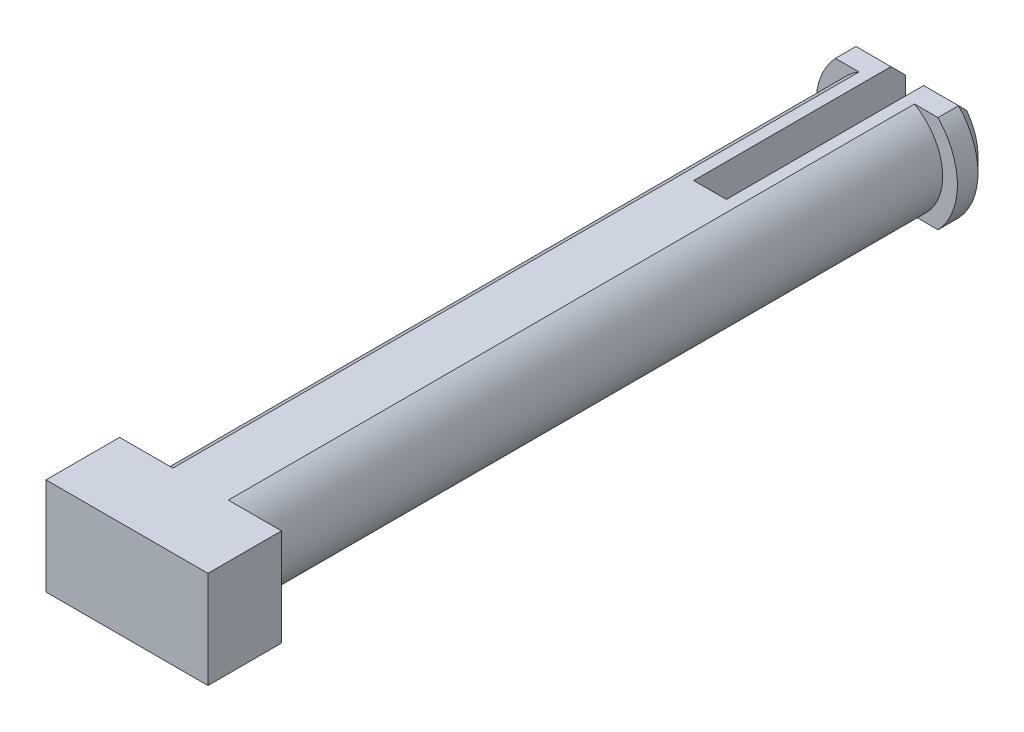
ISO-10303-21;
HEADER;
FILE_DESCRIPTION(('STEP AP214'),'2;1');
FILE_NAME('part.step','',(''),(''),'','','');
FILE_SCHEMA(('AUTOMOTIVE_DESIGN { 1 0 10303 214 1 1 1 1 }'));
ENDSEC;
DATA;
#1=APPLICATION_CONTEXT('core data for automotive mechanical design processes');
#2=APPLICATION_PROTOCOL_DEFINITION('international standard','automotive_design',2000,#1);
#3=PRODUCT_CONTEXT('',#1,'mechanical');
#4=PRODUCT('Part','Part','',(#3));
#5=PRODUCT_RELATED_PRODUCT_CATEGORY('part','',(#4));
#6=PRODUCT_DEFINITION_FORMATION('','',#4);
#7=PRODUCT_DEFINITION_CONTEXT('part definition',#1,'design');
#8=PRODUCT_DEFINITION('design','',#6,#7);
#9=PRODUCT_DEFINITION_SHAPE('','',#8);
#10=(LENGTH_UNIT() NAMED_UNIT(*) SI_UNIT(.MILLI.,.METRE.));
#11=(NAMED_UNIT(*) PLANE_ANGLE_UNIT() SI_UNIT($,.RADIAN.));
#12=(NAMED_UNIT(*) SI_UNIT($,.STERADIAN.) SOLID_ANGLE_UNIT());
#13=UNCERTAINTY_MEASURE_WITH_UNIT(LENGTH_MEASURE(1.E-05),#10,'distance_accuracy_value','');
#14=(GEOMETRIC_REPRESENTATION_CONTEXT(3) GLOBAL_UNCERTAINTY_ASSIGNED_CONTEXT((#13)) GLOBAL_UNIT_ASSIGNED_CONTEXT((#10,
#11,#12)) REPRESENTATION_CONTEXT('',''));
#15=CARTESIAN_POINT('',(0.,0.,0.));
#16=DIRECTION('',(0.,0.,1.));
#17=DIRECTION('',(1.,0.,0.));
#18=AXIS2_PLACEMENT_3D('',#15,#16,#17);
#19=CARTESIAN_POINT('',(-66.7025607667802,-3.96227490896884,-41.5389637783194));
#20=DIRECTION('',(0.,0.,-1.));
#21=DIRECTION('',(-1.,0.,0.));
#22=AXIS2_PLACEMENT_3D('',#19,#20,#21);
#23=PLANE('',#22);
#24=CARTESIAN_POINT('',(-67.5846124205548,-3.37227490896886,-41.5389637783194));
#25=CARTESIAN_POINT('',(-67.5522619842056,-3.32972790171934,-41.5389637783194));
#26=CARTESIAN_POINT('',(-67.5217229321666,-3.28583578238253,-41.5389637783194));
#27=CARTESIAN_POINT('',(-67.4644494482153,-3.19563873478716,-41.5389637783194));
#28=CARTESIAN_POINT('',(-67.4377148375345,-3.14933392003946,-41.5389637783194));
#29=CARTESIAN_POINT('',(-67.3635548359027,-3.00734191422758,-41.5389637783194));
#30=CARTESIAN_POINT('',(-67.3220824232597,-2.90845743374898,-41.5389637783194));
#31=CARTESIAN_POINT('',(-67.2563331172992,-2.70513908441693,-41.5389637783194));
#32=CARTESIAN_POINT('',(-67.2320633039026,-2.60070294970495,-41.5389637783194));
#33=CARTESIAN_POINT('',(-67.2014027690068,-2.38925544141901,-41.5389637783194));
#34=CARTESIAN_POINT('',(-67.1950067065084,-2.28224484678252,-41.5389637783194));
#35=CARTESIAN_POINT('',(-67.200268722267,-2.06866591420379,-41.5389637783194));
#36=CARTESIAN_POINT('',(-67.2119285266223,-1.96209761952093,-41.5389637783194));
#37=CARTESIAN_POINT('',(-67.2529801960669,-1.75240301461169,-41.5389637783194));
#38=CARTESIAN_POINT('',(-67.2823739711556,-1.6492770763997,-41.5389637783194));
#39=CARTESIAN_POINT('',(-67.3525319041563,-1.4640226590677,-41.5389637783194));
#40=CARTESIAN_POINT('',(-67.3910183764261,-1.38102271377649,-41.5389637783194));
#41=CARTESIAN_POINT('',(-67.479441600321,-1.22144301219026,-41.5389637783194));
#42=CARTESIAN_POINT('',(-67.5293702449939,-1.14485876249059,-41.5389637783194));
#43=CARTESIAN_POINT('',(-67.5846124205546,-1.07227490896894,-41.5389637783194));
#44=B_SPLINE_CURVE_WITH_KNOTS('',3,(#24,#25,#26,#27,#28,#29,#30,#31,#32,#33,#34,#35,#36,#37,#38,
#39,#40,#41,#42,#43),.UNSPECIFIED.,.F.,.F.,(4,2,2,2,2,2,2,2,2,4),(0.,0.160248576795769,
0.320489621120828,0.640526560583316,0.960695138447689,1.28076803393214,1.60087152951913,
1.9210095073255,2.19455099917785,2.46789927867105),.UNSPECIFIED.);
#45=CARTESIAN_POINT('',(-67.5846124205548,-3.37227490896887,-41.5389637783194));
#46=VERTEX_POINT('',#45);
#47=CARTESIAN_POINT('',(-67.5846124205547,-1.07227490896885,-41.5389637783194));
#48=VERTEX_POINT('',#47);
#49=EDGE_CURVE('E20',#46,#48,#44,.T.);
#50=ORIENTED_EDGE('',*,*,#49,.F.);
#51=DIRECTION('',(1.,0.,0.));
#52=VECTOR('',#51,1.);
#53=CARTESIAN_POINT('',(-66.8754340104075,-3.37227490896888,-41.5389637783194));
#54=LINE('',#53,#52);
#55=CARTESIAN_POINT('',(-68.5420607667802,-3.37227490896887,-41.5389637783194));
#56=VERTEX_POINT('',#55);
#57=EDGE_CURVE('E362',#56,#46,#54,.T.);
#58=ORIENTED_EDGE('',*,*,#57,.F.);
#59=DIRECTION('',(0.,1.,0.));
#60=VECTOR('',#59,1.);
#61=CARTESIAN_POINT('',(-68.5420607667802,0.117725091031185,-41.5389637783194));
#62=LINE('',#61,#60);
#63=CARTESIAN_POINT('',(-68.5420607667802,-1.07227490896879,-41.5389637783194));
#64=VERTEX_POINT('',#63);
#65=EDGE_CURVE('E117',#64,#56,#62,.F.);
#66=ORIENTED_EDGE('',*,*,#65,.F.);
#67=DIRECTION('',(1.,0.,0.));
#68=VECTOR('',#67,1.);
#69=CARTESIAN_POINT('',(-69.0208450173595,-1.07227490896878,-41.5389637783194));
#70=LINE('',#69,#68);
#71=EDGE_CURVE('E216',#48,#64,#70,.F.);
#72=ORIENTED_EDGE('',*,*,#71,.F.);
#73=EDGE_LOOP('',(#50,#58,#66,#72));
#74=FACE_BOUND('',#73,.T.);
#75=ADVANCED_FACE('F16',(#74),#23,.T.);
#76=CARTESIAN_POINT('',(-69.0970607667802,-2.22227490896883,-43.4389637783194));
#77=CARTESIAN_POINT('',(-69.0970607667802,-4.86347490896883,-40.7977637783194));
#78=CARTESIAN_POINT('',(-69.0970607667802,-2.22227490896883,-43.4389637783194));
#79=CARTESIAN_POINT('',(-66.4558607667802,-4.86347490896883,-40.7977637783194));
#80=CARTESIAN_POINT('',(-69.0970607667802,-2.22227490896883,-43.4389637783194));
#81=CARTESIAN_POINT('',(-66.4558607667802,-2.22227490896883,-40.7977637783194));
#82=CARTESIAN_POINT('',(-69.0970607667802,-2.22227490896883,-43.4389637783194));
#83=CARTESIAN_POINT('',(-66.4558607667802,0.418925091031169,-40.7977637783195));
#84=CARTESIAN_POINT('',(-69.0970607667802,-2.22227490896883,-43.4389637783194));
#85=CARTESIAN_POINT('',(-69.0970607667802,0.41892509103117,-40.7977637783195));
#86=CARTESIAN_POINT('',(-69.0970607667802,-2.22227490896883,-43.4389637783194));
#87=CARTESIAN_POINT('',(-71.7382607667802,0.41892509103117,-40.7977637783195));
#88=CARTESIAN_POINT('',(-69.0970607667802,-2.22227490896883,-43.4389637783194));
#89=CARTESIAN_POINT('',(-71.7382607667802,-2.22227490896883,-40.7977637783194));
#90=CARTESIAN_POINT('',(-69.0970607667802,-2.22227490896883,-43.4389637783194));
#91=CARTESIAN_POINT('',(-71.7382607667802,-4.86347490896883,-40.7977637783194));
#92=CARTESIAN_POINT('',(-69.0970607667802,-2.22227490896883,-43.4389637783194));
#93=CARTESIAN_POINT('',(-69.0970607667802,-4.86347490896883,-40.7977637783194));
#94=(BOUNDED_SURFACE() B_SPLINE_SURFACE(2,1,((#76,#77),(#78,#79),(#80,#81),(#82,#83),(#84,#85),
(#86,#87),(#88,#89),(#90,#91),(#92,#93)),.UNSPECIFIED.,.T.,.F.,
.F.) B_SPLINE_SURFACE_WITH_KNOTS((3,2,2,2,3),(2,2),(0.,1.5707963267949,3.14159265358979,
4.71238898038469,6.28318530717959),(0.,3.73522086093982),
.UNSPECIFIED.) GEOMETRIC_REPRESENTATION_ITEM() RATIONAL_B_SPLINE_SURFACE(((1.,1.),
(0.707106781186548,0.707106781186548),(1.,1.),(0.707106781186548,0.707106781186548),(1.,1.),
(0.707106781186548,0.707106781186548),(1.,1.),(0.707106781186548,0.707106781186548),(1.,1.))) REPRESENTATION_ITEM('') SURFACE());
#95=CARTESIAN_POINT('',(-67.5846124205548,-3.37227490896888,-41.5389637783194));
#96=CARTESIAN_POINT('',(-67.4694153407707,-3.6045810860479,-41.3066576012404));
#97=CARTESIAN_POINT('',(-67.3542182609868,-3.87227490896886,-41.0389637783194));
#98=B_SPLINE_CURVE_WITH_KNOTS('',2,(#95,#96,#97),.UNSPECIFIED.,.F.,.F.,(3,3),(0.,1.),.UNSPECIFIED.);
#99=CARTESIAN_POINT('',(-67.3542182609869,-3.87227490896886,-41.0389637783194));
#100=VERTEX_POINT('',#99);
#101=EDGE_CURVE('E357',#46,#100,#98,.T.);
#102=CARTESIAN_POINT('',(-67.3542182609868,-0.572274908968797,-41.0389637783194));
#103=CARTESIAN_POINT('',(-67.4694153407707,-0.839968731889776,-41.3066576012404));
#104=CARTESIAN_POINT('',(-67.5846124205548,-1.07227490896878,-41.5389637783194));
#105=B_SPLINE_CURVE_WITH_KNOTS('',2,(#102,#103,#104),.UNSPECIFIED.,.F.,.F.,(3,3),(0.,1.),.UNSPECIFIED.);
#106=CARTESIAN_POINT('',(-67.3542182609868,-0.57227490896881,-41.0389637783194));
#107=VERTEX_POINT('',#106);
#108=EDGE_CURVE('E380',#107,#48,#105,.T.);
#109=CARTESIAN_POINT('',(-69.0970607667802,-2.22227490896883,-41.0389637783194));
#110=DIRECTION('',(0.,0.,1.));
#111=DIRECTION('',(0.,-1.,0.));
#112=AXIS2_PLACEMENT_3D('',#109,#110,#111);
#113=CIRCLE('',#112,2.4);
#114=EDGE_CURVE('E233',#100,#107,#113,.T.);
#115=ORIENTED_EDGE('',*,*,#101,.F.);
#116=ORIENTED_EDGE('',*,*,#49,.T.);
#117=ORIENTED_EDGE('',*,*,#108,.F.);
#118=ORIENTED_EDGE('',*,*,#114,.F.);
#119=EDGE_LOOP('',(#115,#116,#117,#118));
#120=FACE_BOUND('',#119,.T.);
#121=ADVANCED_FACE('F248',(#120),#94,.T.);
#122=CARTESIAN_POINT('',(-69.0970607667802,-2.22227490896883,-43.4389637783194));
#123=CARTESIAN_POINT('',(-69.0970607667802,-4.86347490896883,-40.7977637783194));
#124=CARTESIAN_POINT('',(-69.0970607667802,-2.22227490896883,-43.4389637783194));
#125=CARTESIAN_POINT('',(-66.4558607667802,-4.86347490896883,-40.7977637783194));
#126=CARTESIAN_POINT('',(-69.0970607667802,-2.22227490896883,-43.4389637783194));
#127=CARTESIAN_POINT('',(-66.4558607667802,-2.22227490896883,-40.7977637783194));
#128=CARTESIAN_POINT('',(-69.0970607667802,-2.22227490896883,-43.4389637783194));
#129=CARTESIAN_POINT('',(-66.4558607667802,0.418925091031169,-40.7977637783195));
#130=CARTESIAN_POINT('',(-69.0970607667802,-2.22227490896883,-43.4389637783194));
#131=CARTESIAN_POINT('',(-69.0970607667802,0.41892509103117,-40.7977637783195));
#132=CARTESIAN_POINT('',(-69.0970607667802,-2.22227490896883,-43.4389637783194));
#133=CARTESIAN_POINT('',(-71.7382607667802,0.41892509103117,-40.7977637783195));
#134=CARTESIAN_POINT('',(-69.0970607667802,-2.22227490896883,-43.4389637783194));
#135=CARTESIAN_POINT('',(-71.7382607667802,-2.22227490896883,-40.7977637783194));
#136=CARTESIAN_POINT('',(-69.0970607667802,-2.22227490896883,-43.4389637783194));
#137=CARTESIAN_POINT('',(-71.7382607667802,-4.86347490896883,-40.7977637783194));
#138=CARTESIAN_POINT('',(-69.0970607667802,-2.22227490896883,-43.4389637783194));
#139=CARTESIAN_POINT('',(-69.0970607667802,-4.86347490896883,-40.7977637783194));
#140=(BOUNDED_SURFACE() B_SPLINE_SURFACE(2,1,((#122,#123),(#124,#125),(#126,#127),(#128,#129),
(#130,#131),(#132,#133),(#134,#135),(#136,#137),(#138,#139)),.UNSPECIFIED.,.T.,.F.,
.F.) B_SPLINE_SURFACE_WITH_KNOTS((3,2,2,2,3),(2,2),(0.,1.5707963267949,3.14159265358979,
4.71238898038469,6.28318530717959),(0.,3.73522086093982),
.UNSPECIFIED.) GEOMETRIC_REPRESENTATION_ITEM() RATIONAL_B_SPLINE_SURFACE(((1.,1.),
(0.707106781186548,0.707106781186548),(1.,1.),(0.707106781186548,0.707106781186548),(1.,1.),
(0.707106781186548,0.707106781186548),(1.,1.),(0.707106781186548,0.707106781186548),(1.,1.))) REPRESENTATION_ITEM('') SURFACE());
#141=CARTESIAN_POINT('',(-70.6095091130056,-1.07227490896879,-41.5389637783194));
#142=CARTESIAN_POINT('',(-70.7247061927899,-0.839968731889093,-41.3066576012397));
#143=CARTESIAN_POINT('',(-70.8399032725735,-0.572274908968787,-41.0389637783194));
#144=B_SPLINE_CURVE_WITH_KNOTS('',2,(#141,#142,#143),.UNSPECIFIED.,.F.,.F.,(3,3),(0.,1.),.UNSPECIFIED.);
#145=CARTESIAN_POINT('',(-70.6095091130057,-1.07227490896885,-41.5389637783194));
#146=VERTEX_POINT('',#145);
#147=CARTESIAN_POINT('',(-70.8399032725735,-0.572274908968802,-41.0389637783194));
#148=VERTEX_POINT('',#147);
#149=EDGE_CURVE('E193',#146,#148,#144,.T.);
#150=CARTESIAN_POINT('',(-70.6095091130056,-3.37227490896886,-41.5389637783194));
#151=CARTESIAN_POINT('',(-70.6418595493548,-3.32972790171933,-41.5389637783194));
#152=CARTESIAN_POINT('',(-70.6723986013938,-3.28583578238253,-41.5389637783194));
#153=CARTESIAN_POINT('',(-70.7296720853451,-3.19563873478715,-41.5389637783194));
#154=CARTESIAN_POINT('',(-70.7564066960259,-3.14933392003945,-41.5389637783194));
#155=CARTESIAN_POINT('',(-70.8305666976577,-3.00734191422757,-41.5389637783194));
#156=CARTESIAN_POINT('',(-70.8720391103007,-2.90845743374896,-41.5389637783194));
#157=CARTESIAN_POINT('',(-70.9377884162613,-2.7051390844169,-41.5389637783194));
#158=CARTESIAN_POINT('',(-70.9620582296578,-2.60070294970491,-41.5389637783194));
#159=CARTESIAN_POINT('',(-70.9927187645536,-2.38925544141897,-41.5389637783194));
#160=CARTESIAN_POINT('',(-70.999114827052,-2.28224484678247,-41.5389637783194));
#161=CARTESIAN_POINT('',(-70.9938528112934,-2.06866591420374,-41.5389637783194));
#162=CARTESIAN_POINT('',(-70.9821930069381,-1.96209761952088,-41.5389637783194));
#163=CARTESIAN_POINT('',(-70.9411413374936,-1.75240301461165,-41.5389637783194));
#164=CARTESIAN_POINT('',(-70.9117475624048,-1.64927707639968,-41.5389637783194));
#165=CARTESIAN_POINT('',(-70.8415896294041,-1.46402265906769,-41.5389637783194));
#166=CARTESIAN_POINT('',(-70.8031031571343,-1.38102271377647,-41.5389637783194));
#167=CARTESIAN_POINT('',(-70.7146799332394,-1.22144301219025,-41.5389637783194));
#168=CARTESIAN_POINT('',(-70.6647512885666,-1.14485876249058,-41.5389637783194));
#169=CARTESIAN_POINT('',(-70.6095091130058,-1.07227490896894,-41.5389637783194));
#170=B_SPLINE_CURVE_WITH_KNOTS('',3,(#150,#151,#152,#153,#154,#155,#156,#157,#158,#159,#160,
#161,#162,#163,#164,#165,#166,#167,#168,#169),.UNSPECIFIED.,.F.,.F.,(4,2,2,2,2,2,2,2,2,4),(0.,
0.160248576795768,0.320489621120835,0.640526560583328,0.96069513844772,1.28076803393219,
1.60087152951917,1.92100950732553,2.19455099917785,2.46789927867104),.UNSPECIFIED.);
#171=CARTESIAN_POINT('',(-70.6095091130056,-3.37227490896886,-41.5389637783194));
#172=VERTEX_POINT('',#171);
#173=EDGE_CURVE('E234',#172,#146,#170,.T.);
#174=CARTESIAN_POINT('',(-70.8399032725735,-3.87227490896888,-41.0389637783194));
#175=CARTESIAN_POINT('',(-70.7247061927899,-3.60458108604852,-41.3066576012398));
#176=CARTESIAN_POINT('',(-70.6095091130056,-3.37227490896888,-41.5389637783194));
#177=B_SPLINE_CURVE_WITH_KNOTS('',2,(#174,#175,#176),.UNSPECIFIED.,.F.,.F.,(3,3),(0.,1.),.UNSPECIFIED.);
#178=CARTESIAN_POINT('',(-70.8399032725735,-3.87227490896885,-41.0389637783194));
#179=VERTEX_POINT('',#178);
#180=EDGE_CURVE('E323',#179,#172,#177,.T.);
#181=CARTESIAN_POINT('',(-69.0970607667802,-2.22227490896883,-41.0389637783194));
#182=DIRECTION('',(0.,0.,1.));
#183=DIRECTION('',(1.,0.,0.));
#184=AXIS2_PLACEMENT_3D('',#181,#182,#183);
#185=CIRCLE('',#184,2.4);
#186=EDGE_CURVE('E326',#148,#179,#185,.T.);
#187=ORIENTED_EDGE('',*,*,#149,.F.);
#188=ORIENTED_EDGE('',*,*,#173,.F.);
#189=ORIENTED_EDGE('',*,*,#180,.F.);
#190=ORIENTED_EDGE('',*,*,#186,.F.);
#191=EDGE_LOOP('',(#187,#188,#189,#190));
#192=FACE_BOUND('',#191,.T.);
#193=ADVANCED_FACE('F243',(#192),#140,.T.);
#194=CARTESIAN_POINT('',(-69.1575607667802,-3.96227490896884,-41.5389637783194));
#195=DIRECTION('',(0.,0.,-1.));
#196=DIRECTION('',(-1.,0.,0.));
#197=AXIS2_PLACEMENT_3D('',#194,#195,#196);
#198=PLANE('',#197);
#199=ORIENTED_EDGE('',*,*,#173,.T.);
#200=DIRECTION('',(1.,0.,0.));
#201=VECTOR('',#200,1.);
#202=CARTESIAN_POINT('',(-69.1732765162009,-1.07227490896879,-41.5389637783194));
#203=LINE('',#202,#201);
#204=CARTESIAN_POINT('',(-69.6520607667802,-1.0722749089688,-41.5389637783194));
#205=VERTEX_POINT('',#204);
#206=EDGE_CURVE('E127',#205,#146,#203,.F.);
#207=ORIENTED_EDGE('',*,*,#206,.F.);
#208=DIRECTION('',(0.,1.,0.));
#209=VECTOR('',#208,1.);
#210=CARTESIAN_POINT('',(-69.6520607667802,-4.56227490896884,-41.5389637783194));
#211=LINE('',#210,#209);
#212=CARTESIAN_POINT('',(-69.6520607667802,-3.37227490896887,-41.5389637783194));
#213=VERTEX_POINT('',#212);
#214=EDGE_CURVE('E184',#213,#205,#211,.T.);
#215=ORIENTED_EDGE('',*,*,#214,.F.);
#216=DIRECTION('',(1.,0.,0.));
#217=VECTOR('',#216,1.);
#218=CARTESIAN_POINT('',(-69.1732765162009,-3.37227490896888,-41.5389637783194));
#219=LINE('',#218,#217);
#220=EDGE_CURVE('E137',#172,#213,#219,.T.);
#221=ORIENTED_EDGE('',*,*,#220,.F.);
#222=EDGE_LOOP('',(#199,#207,#215,#221));
#223=FACE_BOUND('',#222,.T.);
#224=ADVANCED_FACE('F240',(#223),#198,.T.);
#225=CARTESIAN_POINT('',(-69.1732765162009,-0.162274908968787,-40.6289637783194));
#226=DIRECTION('',(0.,0.707106781186548,-0.707106781186547));
#227=DIRECTION('',(0.,0.707106781186547,0.707106781186548));
#228=AXIS2_PLACEMENT_3D('',#225,#226,#227);
#229=PLANE('',#228);
#230=ORIENTED_EDGE('',*,*,#149,.T.);
#231=DIRECTION('',(1.,0.,0.));
#232=VECTOR('',#231,1.);
#233=CARTESIAN_POINT('',(-72.7570607667802,-0.572274908968824,-41.0389637783194));
#234=LINE('',#233,#232);
#235=CARTESIAN_POINT('',(-69.6520607667802,-0.572274908968819,-41.0389637783194));
#236=VERTEX_POINT('',#235);
#237=EDGE_CURVE('E190',#236,#148,#234,.F.);
#238=ORIENTED_EDGE('',*,*,#237,.F.);
#239=DIRECTION('',(0.,0.707106781186547,0.707106781186548));
#240=VECTOR('',#239,1.);
#241=CARTESIAN_POINT('',(-69.6520607667802,-1.07227490896881,-41.5389637783194));
#242=LINE('',#241,#240);
#243=EDGE_CURVE('E177',#205,#236,#242,.T.);
#244=ORIENTED_EDGE('',*,*,#243,.F.);
#245=ORIENTED_EDGE('',*,*,#206,.T.);
#246=EDGE_LOOP('',(#230,#238,#244,#245));
#247=FACE_BOUND('',#246,.T.);
#248=ADVANCED_FACE('F191',(#247),#229,.T.);
#249=CARTESIAN_POINT('',(-69.0208450173595,-1.48227490896877,-41.9489637783194));
#250=DIRECTION('',(0.,0.707106781186548,-0.707106781186547));
#251=DIRECTION('',(0.,0.707106781186547,0.707106781186548));
#252=AXIS2_PLACEMENT_3D('',#249,#250,#251);
#253=PLANE('',#252);
#254=ORIENTED_EDGE('',*,*,#108,.T.);
#255=ORIENTED_EDGE('',*,*,#71,.T.);
#256=DIRECTION('',(0.,-0.707106781186545,-0.70710678118655));
#257=VECTOR('',#256,1.);
#258=CARTESIAN_POINT('',(-68.5420607667802,-0.572274908968803,-41.0389637783194));
#259=LINE('',#258,#257);
#260=CARTESIAN_POINT('',(-68.5420607667802,-0.572274908968826,-41.0389637783194));
#261=VERTEX_POINT('',#260);
#262=EDGE_CURVE('E211',#261,#64,#259,.T.);
#263=ORIENTED_EDGE('',*,*,#262,.F.);
#264=DIRECTION('',(1.,0.,0.));
#265=VECTOR('',#264,1.);
#266=CARTESIAN_POINT('',(-72.7570607667802,-0.572274908968824,-41.0389637783194));
#267=LINE('',#266,#265);
#268=EDGE_CURVE('E306',#107,#261,#267,.F.);
#269=ORIENTED_EDGE('',*,*,#268,.F.);
#270=EDGE_LOOP('',(#254,#255,#263,#269));
#271=FACE_BOUND('',#270,.T.);
#272=ADVANCED_FACE('F385',(#271),#253,.T.);
#273=CARTESIAN_POINT('',(-68.5420607667802,0.117725091031185,-42.6189637783194));
#274=DIRECTION('',(-1.,0.,0.));
#275=DIRECTION('',(0.,0.,1.));
#276=AXIS2_PLACEMENT_3D('',#273,#274,#275);
#277=PLANE('',#276);
#278=DIRECTION('',(0.,0.,1.));
#279=VECTOR('',#278,1.);
#280=CARTESIAN_POINT('',(-68.5420607667802,-0.572274908968824,-44.0489637783194));
#281=LINE('',#280,#279);
#282=CARTESIAN_POINT('',(-68.5420607667802,-0.572274908968825,-34.3389637783194));
#283=VERTEX_POINT('',#282);
#284=EDGE_CURVE('E204',#261,#283,#281,.T.);
#285=ORIENTED_EDGE('',*,*,#284,.F.);
#286=ORIENTED_EDGE('',*,*,#262,.T.);
#287=ORIENTED_EDGE('',*,*,#65,.T.);
#288=DIRECTION('',(0.,0.70710678118655,-0.707106781186545));
#289=VECTOR('',#288,1.);
#290=CARTESIAN_POINT('',(-68.5420607667802,-2.96227490896889,-41.9489637783194));
#291=LINE('',#290,#289);
#292=CARTESIAN_POINT('',(-68.5420607667802,-3.87227490896883,-41.0389637783194));
#293=VERTEX_POINT('',#292);
#294=EDGE_CURVE('E158',#293,#56,#291,.T.);
#295=ORIENTED_EDGE('',*,*,#294,.F.);
#296=DIRECTION('',(0.,0.,-1.));
#297=VECTOR('',#296,1.);
#298=CARTESIAN_POINT('',(-68.5420607667802,-3.87227490896882,-11.5289637783194));
#299=LINE('',#298,#297);
#300=CARTESIAN_POINT('',(-68.5420607667802,-3.87227490896882,-34.3389637783194));
#301=VERTEX_POINT('',#300);
#302=EDGE_CURVE('E163',#301,#293,#299,.T.);
#303=ORIENTED_EDGE('',*,*,#302,.F.);
#304=DIRECTION('',(0.,1.,0.));
#305=VECTOR('',#304,1.);
#306=CARTESIAN_POINT('',(-68.5420607667802,-4.56227490896883,-34.3389637783194));
#307=LINE('',#306,#305);
#308=EDGE_CURVE('E210',#283,#301,#307,.F.);
#309=ORIENTED_EDGE('',*,*,#308,.F.);
#310=EDGE_LOOP('',(#285,#286,#287,#295,#303,#309));
#311=FACE_BOUND('',#310,.T.);
#312=ADVANCED_FACE('F353',(#311),#277,.T.);
#313=CARTESIAN_POINT('',(-66.8754340104075,-2.96227490896889,-41.9489637783194));
#314=DIRECTION('',(0.,-0.707106781186545,-0.70710678118655));
#315=DIRECTION('',(0.,0.70710678118655,-0.707106781186545));
#316=AXIS2_PLACEMENT_3D('',#313,#314,#315);
#317=PLANE('',#316);
#318=ORIENTED_EDGE('',*,*,#101,.T.);
#319=DIRECTION('',(1.,0.,0.));
#320=VECTOR('',#319,1.);
#321=CARTESIAN_POINT('',(-72.7570607667802,-3.87227490896882,-41.0389637783194));
#322=LINE('',#321,#320);
#323=EDGE_CURVE('E363',#293,#100,#322,.T.);
#324=ORIENTED_EDGE('',*,*,#323,.F.);
#325=ORIENTED_EDGE('',*,*,#294,.T.);
#326=ORIENTED_EDGE('',*,*,#57,.T.);
#327=EDGE_LOOP('',(#318,#324,#325,#326));
#328=FACE_BOUND('',#327,.T.);
#329=ADVANCED_FACE('F272',(#328),#317,.T.);
#330=CARTESIAN_POINT('',(-69.0970607667802,-2.22227490896883,-41.1101637783194));
#331=DIRECTION('',(0.,0.,1.));
#332=DIRECTION('',(0.,-1.,0.));
#333=AXIS2_PLACEMENT_3D('',#330,#331,#332);
#334=CYLINDRICAL_SURFACE('',#333,2.4);
#335=DIRECTION('',(0.,0.,1.));
#336=VECTOR('',#335,1.);
#337=CARTESIAN_POINT('',(-67.3542182609868,-0.572274908968824,-44.0489637783194));
#338=LINE('',#337,#336);
#339=CARTESIAN_POINT('',(-67.3542182609868,-0.572274908968824,-40.3389637783194));
#340=VERTEX_POINT('',#339);
#341=EDGE_CURVE('E309',#340,#107,#338,.F.);
#342=ORIENTED_EDGE('',*,*,#341,.F.);
#343=CARTESIAN_POINT('',(-69.0970607667802,-2.22227490896883,-40.3389637783194));
#344=DIRECTION('',(0.,0.,1.));
#345=DIRECTION('',(0.,-1.,0.));
#346=AXIS2_PLACEMENT_3D('',#343,#344,#345);
#347=CIRCLE('',#346,2.4);
#348=CARTESIAN_POINT('',(-67.3542182609868,-3.87227490896882,-40.3389637783194));
#349=VERTEX_POINT('',#348);
#350=EDGE_CURVE('E232',#349,#340,#347,.T.);
#351=ORIENTED_EDGE('',*,*,#350,.F.);
#352=DIRECTION('',(0.,0.,-1.));
#353=VECTOR('',#352,1.);
#354=CARTESIAN_POINT('',(-67.3542182609868,-3.87227490896882,-11.5289637783194));
#355=LINE('',#354,#353);
#356=EDGE_CURVE('E427',#100,#349,#355,.F.);
#357=ORIENTED_EDGE('',*,*,#356,.F.);
#358=ORIENTED_EDGE('',*,*,#114,.T.);
#359=EDGE_LOOP('',(#342,#351,#357,#358));
#360=FACE_BOUND('',#359,.T.);
#361=ADVANCED_FACE('F268',(#360),#334,.T.);
#362=CARTESIAN_POINT('',(-68.6607813643022,-4.56227490896882,-40.3389637783194));
#363=DIRECTION('',(0.,0.,1.));
#364=DIRECTION('',(1.,0.,0.));
#365=AXIS2_PLACEMENT_3D('',#362,#363,#364);
#366=PLANE('',#365);
#367=ORIENTED_EDGE('',*,*,#350,.T.);
#368=DIRECTION('',(1.,0.,0.));
#369=VECTOR('',#368,1.);
#370=CARTESIAN_POINT('',(-72.7570607667802,-0.572274908968824,-40.3389637783194));
#371=LINE('',#370,#369);
#372=CARTESIAN_POINT('',(-68.1549885827093,-0.572274908968824,-40.3389637783194));
#373=VERTEX_POINT('',#372);
#374=EDGE_CURVE('E417',#373,#340,#371,.T.);
#375=ORIENTED_EDGE('',*,*,#374,.F.);
#376=CARTESIAN_POINT('',(-69.0970607667802,-2.22227490896883,-40.3389637783194));
#377=DIRECTION('',(0.,0.,1.));
#378=DIRECTION('',(1.,0.,0.));
#379=AXIS2_PLACEMENT_3D('',#376,#377,#378);
#380=CIRCLE('',#379,1.90000000000001);
#381=CARTESIAN_POINT('',(-68.1549885827093,-3.87227490896882,-40.3389637783194));
#382=VERTEX_POINT('',#381);
#383=EDGE_CURVE('E230',#382,#373,#380,.T.);
#384=ORIENTED_EDGE('',*,*,#383,.F.);
#385=DIRECTION('',(1.,0.,0.));
#386=VECTOR('',#385,1.);
#387=CARTESIAN_POINT('',(-72.7570607667802,-3.87227490896882,-40.3389637783194));
#388=LINE('',#387,#386);
#389=EDGE_CURVE('E467',#349,#382,#388,.F.);
#390=ORIENTED_EDGE('',*,*,#389,.F.);
#391=EDGE_LOOP('',(#367,#375,#384,#390));
#392=FACE_BOUND('',#391,.T.);
#393=ADVANCED_FACE('F271',(#392),#366,.T.);
#394=CARTESIAN_POINT('',(-69.0970607667802,-2.22227490896883,-42.6701637783194));
#395=DIRECTION('',(0.,0.,1.));
#396=DIRECTION('',(1.,0.,0.));
#397=AXIS2_PLACEMENT_3D('',#394,#395,#396);
#398=CYLINDRICAL_SURFACE('',#397,1.90000000000001);
#399=ORIENTED_EDGE('',*,*,#383,.T.);
#400=DIRECTION('',(0.,0.,1.));
#401=VECTOR('',#400,1.);
#402=CARTESIAN_POINT('',(-68.1549885827093,-0.572274908968824,-44.0489637783194));
#403=LINE('',#402,#401);
#404=CARTESIAN_POINT('',(-68.1549885827093,-0.572274908968824,-17.0389637783194));
#405=VERTEX_POINT('',#404);
#406=EDGE_CURVE('E414',#405,#373,#403,.F.);
#407=ORIENTED_EDGE('',*,*,#406,.F.);
#408=CARTESIAN_POINT('',(-69.0970607667802,-2.22227490896883,-17.0389637783194));
#409=DIRECTION('',(0.,0.,1.));
#410=DIRECTION('',(1.,0.,0.));
#411=AXIS2_PLACEMENT_3D('',#408,#409,#410);
#412=CIRCLE('',#411,1.90000000000001);
#413=CARTESIAN_POINT('',(-68.1549885827093,-3.87227490896882,-17.0389637783194));
#414=VERTEX_POINT('',#413);
#415=EDGE_CURVE('E227',#414,#405,#412,.T.);
#416=ORIENTED_EDGE('',*,*,#415,.F.);
#417=DIRECTION('',(0.,0.,-1.));
#418=VECTOR('',#417,1.);
#419=CARTESIAN_POINT('',(-68.1549885827093,-3.87227490896882,-11.5289637783194));
#420=LINE('',#419,#418);
#421=EDGE_CURVE('E464',#382,#414,#420,.F.);
#422=ORIENTED_EDGE('',*,*,#421,.F.);
#423=EDGE_LOOP('',(#399,#407,#416,#422));
#424=FACE_BOUND('',#423,.T.);
#425=ADVANCED_FACE('F274',(#424),#398,.T.);
#426=CARTESIAN_POINT('',(-65.8062679851873,-4.56227490896883,-17.0389637783194));
#427=DIRECTION('',(0.,0.,-1.));
#428=DIRECTION('',(-1.,0.,0.));
#429=AXIS2_PLACEMENT_3D('',#426,#427,#428);
#430=PLANE('',#429);
#431=DIRECTION('',(1.,0.,0.));
#432=VECTOR('',#431,1.);
#433=CARTESIAN_POINT('',(-72.7570607667802,-3.87227490896882,-17.0389637783194));
#434=LINE('',#433,#432);
#435=CARTESIAN_POINT('',(-66.3470607667802,-3.87227490896882,-17.0389637783194));
#436=VERTEX_POINT('',#435);
#437=EDGE_CURVE('E460',#414,#436,#434,.T.);
#438=ORIENTED_EDGE('',*,*,#437,.F.);
#439=ORIENTED_EDGE('',*,*,#415,.T.);
#440=DIRECTION('',(1.,0.,0.));
#441=VECTOR('',#440,1.);
#442=CARTESIAN_POINT('',(-72.7570607667802,-0.572274908968824,-17.0389637783194));
#443=LINE('',#442,#441);
#444=CARTESIAN_POINT('',(-66.3470607667802,-0.572274908968824,-17.0389637783194));
#445=VERTEX_POINT('',#444);
#446=EDGE_CURVE('E411',#445,#405,#443,.F.);
#447=ORIENTED_EDGE('',*,*,#446,.F.);
#448=DIRECTION('',(0.,1.,0.));
#449=VECTOR('',#448,1.);
#450=CARTESIAN_POINT('',(-66.3470607667802,-4.56227490896883,-17.0389637783194));
#451=LINE('',#450,#449);
#452=EDGE_CURVE('E229',#436,#445,#451,.T.);
#453=ORIENTED_EDGE('',*,*,#452,.F.);
#454=EDGE_LOOP('',(#438,#439,#447,#453));
#455=FACE_BOUND('',#454,.T.);
#456=ADVANCED_FACE('F276',(#455),#430,.T.);
#457=CARTESIAN_POINT('',(-66.3470607667802,-4.56227490896883,-17.6489637783194));
#458=DIRECTION('',(1.,0.,0.));
#459=DIRECTION('',(0.,0.,-1.));
#460=AXIS2_PLACEMENT_3D('',#457,#458,#459);
#461=PLANE('',#460);
#462=DIRECTION('',(0.,0.,1.));
#463=VECTOR('',#462,1.);
#464=CARTESIAN_POINT('',(-66.3470607667802,-0.572274908968824,-44.0489637783194));
#465=LINE('',#464,#463);
#466=CARTESIAN_POINT('',(-66.3470607667802,-0.572274908968824,-14.5389637783194));
#467=VERTEX_POINT('',#466);
#468=EDGE_CURVE('E408',#467,#445,#465,.F.);
#469=ORIENTED_EDGE('',*,*,#468,.F.);
#470=DIRECTION('',(0.,1.,0.));
#471=VECTOR('',#470,1.);
#472=CARTESIAN_POINT('',(-66.3470607667802,-4.56227490896882,-14.5389637783194));
#473=LINE('',#472,#471);
#474=CARTESIAN_POINT('',(-66.3470607667802,-3.87227490896882,-14.5389637783194));
#475=VERTEX_POINT('',#474);
#476=EDGE_CURVE('E453',#475,#467,#473,.T.);
#477=ORIENTED_EDGE('',*,*,#476,.F.);
#478=DIRECTION('',(0.,0.,-1.));
#479=VECTOR('',#478,1.);
#480=CARTESIAN_POINT('',(-66.3470607667802,-3.87227490896882,-11.5289637783194));
#481=LINE('',#480,#479);
#482=EDGE_CURVE('E456',#436,#475,#481,.F.);
#483=ORIENTED_EDGE('',*,*,#482,.F.);
#484=ORIENTED_EDGE('',*,*,#452,.T.);
#485=EDGE_LOOP('',(#469,#477,#483,#484));
#486=FACE_BOUND('',#485,.T.);
#487=ADVANCED_FACE('F339',(#486),#461,.T.);
#488=CARTESIAN_POINT('',(-72.7570607667802,-4.56227490896882,-14.5389637783194));
#489=DIRECTION('',(0.,0.,1.));
#490=DIRECTION('',(1.,0.,0.));
#491=AXIS2_PLACEMENT_3D('',#488,#489,#490);
#492=PLANE('',#491);
#493=DIRECTION('',(0.,1.,0.));
#494=VECTOR('',#493,1.);
#495=CARTESIAN_POINT('',(-71.8470607667802,0.117725091031175,-14.5389637783194));
#496=LINE('',#495,#494);
#497=CARTESIAN_POINT('',(-71.8470607667802,-3.87227490896882,-14.5389637783194));
#498=VERTEX_POINT('',#497);
#499=CARTESIAN_POINT('',(-71.8470607667802,-0.572274908968824,-14.5389637783194));
#500=VERTEX_POINT('',#499);
#501=EDGE_CURVE('E446',#498,#500,#496,.T.);
#502=ORIENTED_EDGE('',*,*,#501,.F.);
#503=DIRECTION('',(1.,0.,0.));
#504=VECTOR('',#503,1.);
#505=CARTESIAN_POINT('',(-72.7570607667802,-3.87227490896882,-14.5389637783194));
#506=LINE('',#505,#504);
#507=EDGE_CURVE('E451',#475,#498,#506,.F.);
#508=ORIENTED_EDGE('',*,*,#507,.F.);
#509=ORIENTED_EDGE('',*,*,#476,.T.);
#510=DIRECTION('',(1.,0.,0.));
#511=VECTOR('',#510,1.);
#512=CARTESIAN_POINT('',(-72.7570607667802,-0.572274908968824,-14.5389637783194));
#513=LINE('',#512,#511);
#514=EDGE_CURVE('E405',#500,#467,#513,.T.);
#515=ORIENTED_EDGE('',*,*,#514,.F.);
#516=EDGE_LOOP('',(#502,#508,#509,#515));
#517=FACE_BOUND('',#516,.T.);
#518=ADVANCED_FACE('F289',(#517),#492,.T.);
#519=CARTESIAN_POINT('',(-71.8470607667802,0.117725091031175,-17.6489637783194));
#520=DIRECTION('',(-1.,0.,0.));
#521=DIRECTION('',(0.,0.,1.));
#522=AXIS2_PLACEMENT_3D('',#519,#520,#521);
#523=PLANE('',#522);
#524=DIRECTION('',(0.,0.,-1.));
#525=VECTOR('',#524,1.);
#526=CARTESIAN_POINT('',(-71.8470607667802,-3.87227490896882,-11.5289637783194));
#527=LINE('',#526,#525);
#528=CARTESIAN_POINT('',(-71.8470607667802,-3.87227490896882,-17.0389637783194));
#529=VERTEX_POINT('',#528);
#530=EDGE_CURVE('E322',#498,#529,#527,.T.);
#531=ORIENTED_EDGE('',*,*,#530,.F.);
#532=ORIENTED_EDGE('',*,*,#501,.T.);
#533=DIRECTION('',(0.,0.,1.));
#534=VECTOR('',#533,1.);
#535=CARTESIAN_POINT('',(-71.8470607667802,-0.572274908968824,-44.0489637783194));
#536=LINE('',#535,#534);
#537=CARTESIAN_POINT('',(-71.8470607667802,-0.572274908968824,-17.0389637783194));
#538=VERTEX_POINT('',#537);
#539=EDGE_CURVE('E319',#538,#500,#536,.T.);
#540=ORIENTED_EDGE('',*,*,#539,.F.);
#541=DIRECTION('',(0.,1.,0.));
#542=VECTOR('',#541,1.);
#543=CARTESIAN_POINT('',(-71.8470607667802,-4.56227490896883,-17.0389637783194));
#544=LINE('',#543,#542);
#545=EDGE_CURVE('E375',#529,#538,#544,.T.);
#546=ORIENTED_EDGE('',*,*,#545,.F.);
#547=EDGE_LOOP('',(#531,#532,#540,#546));
#548=FACE_BOUND('',#547,.T.);
#549=ADVANCED_FACE('F281',(#548),#523,.T.);
#550=CARTESIAN_POINT('',(-69.0970607667802,-2.22227490896883,-41.1101637783194));
#551=DIRECTION('',(0.,0.,1.));
#552=DIRECTION('',(0.,-1.,0.));
#553=AXIS2_PLACEMENT_3D('',#550,#551,#552);
#554=CYLINDRICAL_SURFACE('',#553,2.4);
#555=DIRECTION('',(0.,0.,-1.));
#556=VECTOR('',#555,1.);
#557=CARTESIAN_POINT('',(-70.8399032725735,-3.87227490896882,-11.5289637783194));
#558=LINE('',#557,#556);
#559=CARTESIAN_POINT('',(-70.8399032725735,-3.87227490896882,-40.3389637783194));
#560=VERTEX_POINT('',#559);
#561=EDGE_CURVE('E314',#560,#179,#558,.T.);
#562=ORIENTED_EDGE('',*,*,#561,.F.);
#563=CARTESIAN_POINT('',(-69.0970607667802,-2.22227490896883,-40.3389637783194));
#564=DIRECTION('',(0.,0.,1.));
#565=DIRECTION('',(0.,-1.,0.));
#566=AXIS2_PLACEMENT_3D('',#563,#564,#565);
#567=CIRCLE('',#566,2.4);
#568=CARTESIAN_POINT('',(-70.8399032725735,-0.572274908968823,-40.3389637783194));
#569=VERTEX_POINT('',#568);
#570=EDGE_CURVE('E224',#569,#560,#567,.T.);
#571=ORIENTED_EDGE('',*,*,#570,.F.);
#572=DIRECTION('',(0.,0.,1.));
#573=VECTOR('',#572,1.);
#574=CARTESIAN_POINT('',(-70.8399032725735,-0.572274908968824,-44.0489637783194));
#575=LINE('',#574,#573);
#576=EDGE_CURVE('E196',#148,#569,#575,.T.);
#577=ORIENTED_EDGE('',*,*,#576,.F.);
#578=ORIENTED_EDGE('',*,*,#186,.T.);
#579=EDGE_LOOP('',(#562,#571,#577,#578));
#580=FACE_BOUND('',#579,.T.);
#581=ADVANCED_FACE('F278',(#580),#554,.T.);
#582=CARTESIAN_POINT('',(-69.1732765162009,-2.96227490896889,-41.9489637783194));
#583=DIRECTION('',(0.,-0.707106781186545,-0.70710678118655));
#584=DIRECTION('',(0.,0.70710678118655,-0.707106781186545));
#585=AXIS2_PLACEMENT_3D('',#582,#583,#584);
#586=PLANE('',#585);
#587=ORIENTED_EDGE('',*,*,#180,.T.);
#588=ORIENTED_EDGE('',*,*,#220,.T.);
#589=DIRECTION('',(0.,0.70710678118654,-0.707106781186555));
#590=VECTOR('',#589,1.);
#591=CARTESIAN_POINT('',(-69.6520607667802,-3.87227490896885,-41.0389637783194));
#592=LINE('',#591,#590);
#593=CARTESIAN_POINT('',(-69.6520607667802,-3.87227490896883,-41.0389637783194));
#594=VERTEX_POINT('',#593);
#595=EDGE_CURVE('E214',#594,#213,#592,.T.);
#596=ORIENTED_EDGE('',*,*,#595,.F.);
#597=DIRECTION('',(1.,0.,0.));
#598=VECTOR('',#597,1.);
#599=CARTESIAN_POINT('',(-72.7570607667802,-3.87227490896882,-41.0389637783194));
#600=LINE('',#599,#598);
#601=EDGE_CURVE('E437',#179,#594,#600,.T.);
#602=ORIENTED_EDGE('',*,*,#601,.F.);
#603=EDGE_LOOP('',(#587,#588,#596,#602));
#604=FACE_BOUND('',#603,.T.);
#605=ADVANCED_FACE('F280',(#604),#586,.T.);
#606=CARTESIAN_POINT('',(-69.6520607667802,-4.56227490896884,-42.6189637783194));
#607=DIRECTION('',(1.,0.,0.));
#608=DIRECTION('',(0.,0.,-1.));
#609=AXIS2_PLACEMENT_3D('',#606,#607,#608);
#610=PLANE('',#609);
#611=ORIENTED_EDGE('',*,*,#214,.T.);
#612=ORIENTED_EDGE('',*,*,#243,.T.);
#613=DIRECTION('',(0.,0.,1.));
#614=VECTOR('',#613,1.);
#615=CARTESIAN_POINT('',(-69.6520607667802,-0.572274908968824,-44.0489637783194));
#616=LINE('',#615,#614);
#617=CARTESIAN_POINT('',(-69.6520607667802,-0.572274908968825,-34.3389637783194));
#618=VERTEX_POINT('',#617);
#619=EDGE_CURVE('E181',#618,#236,#616,.F.);
#620=ORIENTED_EDGE('',*,*,#619,.F.);
#621=DIRECTION('',(0.,1.,0.));
#622=VECTOR('',#621,1.);
#623=CARTESIAN_POINT('',(-69.6520607667802,-4.56227490896883,-34.3389637783194));
#624=LINE('',#623,#622);
#625=CARTESIAN_POINT('',(-69.6520607667802,-3.87227490896882,-34.3389637783194));
#626=VERTEX_POINT('',#625);
#627=EDGE_CURVE('E186',#626,#618,#624,.T.);
#628=ORIENTED_EDGE('',*,*,#627,.F.);
#629=DIRECTION('',(0.,0.,-1.));
#630=VECTOR('',#629,1.);
#631=CARTESIAN_POINT('',(-69.6520607667802,-3.87227490896882,-11.5289637783194));
#632=LINE('',#631,#630);
#633=EDGE_CURVE('E378',#594,#626,#632,.F.);
#634=ORIENTED_EDGE('',*,*,#633,.F.);
#635=ORIENTED_EDGE('',*,*,#595,.T.);
#636=EDGE_LOOP('',(#611,#612,#620,#628,#634,#635));
#637=FACE_BOUND('',#636,.T.);
#638=ADVANCED_FACE('F179',(#637),#610,.T.);
#639=CARTESIAN_POINT('',(-68.0710607667802,-4.56227490896883,-34.3389637783194));
#640=DIRECTION('',(0.,0.,-1.));
#641=DIRECTION('',(-1.,0.,0.));
#642=AXIS2_PLACEMENT_3D('',#639,#640,#641);
#643=PLANE('',#642);
#644=DIRECTION('',(1.,0.,0.));
#645=VECTOR('',#644,1.);
#646=CARTESIAN_POINT('',(-72.7570607667802,-0.572274908968824,-34.3389637783194));
#647=LINE('',#646,#645);
#648=EDGE_CURVE('E202',#283,#618,#647,.F.);
#649=ORIENTED_EDGE('',*,*,#648,.F.);
#650=ORIENTED_EDGE('',*,*,#308,.T.);
#651=DIRECTION('',(1.,0.,0.));
#652=VECTOR('',#651,1.);
#653=CARTESIAN_POINT('',(-72.7570607667802,-3.87227490896882,-34.3389637783194));
#654=LINE('',#653,#652);
#655=EDGE_CURVE('E223',#626,#301,#654,.T.);
#656=ORIENTED_EDGE('',*,*,#655,.F.);
#657=ORIENTED_EDGE('',*,*,#627,.T.);
#658=EDGE_LOOP('',(#649,#650,#656,#657));
#659=FACE_BOUND('',#658,.T.);
#660=ADVANCED_FACE('F433',(#659),#643,.T.);
#661=CARTESIAN_POINT('',(-69.4983401692581,-4.56227490896883,-17.0389637783194));
#662=DIRECTION('',(0.,0.,-1.));
#663=DIRECTION('',(-1.,0.,0.));
#664=AXIS2_PLACEMENT_3D('',#661,#662,#663);
#665=PLANE('',#664);
#666=DIRECTION('',(1.,0.,0.));
#667=VECTOR('',#666,1.);
#668=CARTESIAN_POINT('',(-72.7570607667802,-0.572274908968824,-17.0389637783194));
#669=LINE('',#668,#667);
#670=CARTESIAN_POINT('',(-70.039132950851,-0.572274908968823,-17.0389637783194));
#671=VERTEX_POINT('',#670);
#672=EDGE_CURVE('E316',#671,#538,#669,.F.);
#673=ORIENTED_EDGE('',*,*,#672,.F.);
#674=CARTESIAN_POINT('',(-69.0970607667802,-2.22227490896883,-17.0389637783194));
#675=DIRECTION('',(0.,0.,1.));
#676=DIRECTION('',(1.,0.,0.));
#677=AXIS2_PLACEMENT_3D('',#674,#675,#676);
#678=CIRCLE('',#677,1.90000000000001);
#679=CARTESIAN_POINT('',(-70.039132950851,-3.87227490896883,-17.0389637783194));
#680=VERTEX_POINT('',#679);
#681=EDGE_CURVE('E220',#680,#671,#678,.F.);
#682=ORIENTED_EDGE('',*,*,#681,.F.);
#683=DIRECTION('',(1.,0.,0.));
#684=VECTOR('',#683,1.);
#685=CARTESIAN_POINT('',(-72.7570607667802,-3.87227490896882,-17.0389637783194));
#686=LINE('',#685,#684);
#687=EDGE_CURVE('E315',#529,#680,#686,.T.);
#688=ORIENTED_EDGE('',*,*,#687,.F.);
#689=ORIENTED_EDGE('',*,*,#545,.T.);
#690=EDGE_LOOP('',(#673,#682,#688,#689));
#691=FACE_BOUND('',#690,.T.);
#692=ADVANCED_FACE('F483',(#691),#665,.T.);
#693=CARTESIAN_POINT('',(-72.7570607667802,-0.572274908968824,-44.0489637783194));
#694=DIRECTION('',(0.,1.,0.));
#695=DIRECTION('',(0.,0.,1.));
#696=AXIS2_PLACEMENT_3D('',#693,#694,#695);
#697=PLANE('',#696);
#698=ORIENTED_EDGE('',*,*,#341,.T.);
#699=ORIENTED_EDGE('',*,*,#268,.T.);
#700=ORIENTED_EDGE('',*,*,#284,.T.);
#701=ORIENTED_EDGE('',*,*,#648,.T.);
#702=ORIENTED_EDGE('',*,*,#619,.T.);
#703=ORIENTED_EDGE('',*,*,#237,.T.);
#704=ORIENTED_EDGE('',*,*,#576,.T.);
#705=DIRECTION('',(1.,0.,0.));
#706=VECTOR('',#705,1.);
#707=CARTESIAN_POINT('',(-72.0028535483731,-0.572274908968822,-40.3389637783194));
#708=LINE('',#707,#706);
#709=CARTESIAN_POINT('',(-70.039132950851,-0.57227490896882,-40.3389637783194));
#710=VERTEX_POINT('',#709);
#711=EDGE_CURVE('E226',#710,#569,#708,.F.);
#712=ORIENTED_EDGE('',*,*,#711,.F.);
#713=DIRECTION('',(0.,0.,-1.));
#714=VECTOR('',#713,1.);
#715=CARTESIAN_POINT('',(-70.039132950851,-0.572274908968818,-28.6889637783194));
#716=LINE('',#715,#714);
#717=EDGE_CURVE('E219',#671,#710,#716,.T.);
#718=ORIENTED_EDGE('',*,*,#717,.F.);
#719=ORIENTED_EDGE('',*,*,#672,.T.);
#720=ORIENTED_EDGE('',*,*,#539,.T.);
#721=ORIENTED_EDGE('',*,*,#514,.T.);
#722=ORIENTED_EDGE('',*,*,#468,.T.);
#723=ORIENTED_EDGE('',*,*,#446,.T.);
#724=ORIENTED_EDGE('',*,*,#406,.T.);
#725=ORIENTED_EDGE('',*,*,#374,.T.);
#726=EDGE_LOOP('',(#698,#699,#700,#701,#702,#703,#704,#712,#718,#719,#720,#721,#722,#723,#724,#725));
#727=FACE_BOUND('',#726,.T.);
#728=ADVANCED_FACE('F199',(#727),#697,.T.);
#729=CARTESIAN_POINT('',(-72.0028535483731,-4.56227490896883,-40.3389637783194));
#730=DIRECTION('',(0.,0.,1.));
#731=DIRECTION('',(1.,0.,0.));
#732=AXIS2_PLACEMENT_3D('',#729,#730,#731);
#733=PLANE('',#732);
#734=ORIENTED_EDGE('',*,*,#570,.T.);
#735=DIRECTION('',(1.,0.,0.));
#736=VECTOR('',#735,1.);
#737=CARTESIAN_POINT('',(-72.7570607667802,-3.87227490896882,-40.3389637783194));
#738=LINE('',#737,#736);
#739=CARTESIAN_POINT('',(-70.039132950851,-3.87227490896883,-40.3389637783194));
#740=VERTEX_POINT('',#739);
#741=EDGE_CURVE('E40',#740,#560,#738,.F.);
#742=ORIENTED_EDGE('',*,*,#741,.F.);
#743=CARTESIAN_POINT('',(-69.0970607667802,-2.22227490896883,-40.3389637783194));
#744=DIRECTION('',(0.,0.,1.));
#745=DIRECTION('',(1.,0.,0.));
#746=AXIS2_PLACEMENT_3D('',#743,#744,#745);
#747=CIRCLE('',#746,1.90000000000001);
#748=EDGE_CURVE('E31',#710,#740,#747,.T.);
#749=ORIENTED_EDGE('',*,*,#748,.F.);
#750=ORIENTED_EDGE('',*,*,#711,.T.);
#751=EDGE_LOOP('',(#734,#742,#749,#750));
#752=FACE_BOUND('',#751,.T.);
#753=ADVANCED_FACE('F299',(#752),#733,.T.);
#754=CARTESIAN_POINT('',(-72.7570607667802,-3.87227490896882,-11.5289637783194));
#755=DIRECTION('',(0.,-1.,0.));
#756=DIRECTION('',(0.,0.,-1.));
#757=AXIS2_PLACEMENT_3D('',#754,#755,#756);
#758=PLANE('',#757);
#759=ORIENTED_EDGE('',*,*,#633,.T.);
#760=ORIENTED_EDGE('',*,*,#655,.T.);
#761=ORIENTED_EDGE('',*,*,#302,.T.);
#762=ORIENTED_EDGE('',*,*,#323,.T.);
#763=ORIENTED_EDGE('',*,*,#356,.T.);
#764=ORIENTED_EDGE('',*,*,#389,.T.);
#765=ORIENTED_EDGE('',*,*,#421,.T.);
#766=ORIENTED_EDGE('',*,*,#437,.T.);
#767=ORIENTED_EDGE('',*,*,#482,.T.);
#768=ORIENTED_EDGE('',*,*,#507,.T.);
#769=ORIENTED_EDGE('',*,*,#530,.T.);
#770=ORIENTED_EDGE('',*,*,#687,.T.);
#771=DIRECTION('',(0.,0.,1.));
#772=VECTOR('',#771,1.);
#773=CARTESIAN_POINT('',(-70.039132950851,-3.87227490896885,-28.6889637783194));
#774=LINE('',#773,#772);
#775=EDGE_CURVE('E11',#740,#680,#774,.T.);
#776=ORIENTED_EDGE('',*,*,#775,.F.);
#777=ORIENTED_EDGE('',*,*,#741,.T.);
#778=ORIENTED_EDGE('',*,*,#561,.T.);
#779=ORIENTED_EDGE('',*,*,#601,.T.);
#780=EDGE_LOOP('',(#759,#760,#761,#762,#763,#764,#765,#766,#767,#768,#769,#770,#776,#777,#778,#779));
#781=FACE_BOUND('',#780,.T.);
#782=ADVANCED_FACE('F294',(#781),#758,.T.);
#783=CARTESIAN_POINT('',(-69.0970607667802,-2.22227490896883,-42.6701637783194));
#784=DIRECTION('',(0.,0.,1.));
#785=DIRECTION('',(1.,0.,0.));
#786=AXIS2_PLACEMENT_3D('',#783,#784,#785);
#787=CYLINDRICAL_SURFACE('',#786,1.90000000000001);
#788=ORIENTED_EDGE('',*,*,#748,.T.);
#789=ORIENTED_EDGE('',*,*,#775,.T.);
#790=ORIENTED_EDGE('',*,*,#681,.T.);
#791=ORIENTED_EDGE('',*,*,#717,.T.);
#792=EDGE_LOOP('',(#788,#789,#790,#791));
#793=FACE_BOUND('',#792,.T.);
#794=ADVANCED_FACE('F18',(#793),#787,.T.);
#795=CLOSED_SHELL('',(#75,#121,#193,#224,#248,#272,#312,#329,#361,#393,#425,#456,#487,#518,#549,
#581,#605,#638,#660,#692,#728,#753,#782,#794));
#796=MANIFOLD_SOLID_BREP('B1',#795);
#797=ADVANCED_BREP_SHAPE_REPRESENTATION('',(#18,#796),#14);
#798=SHAPE_DEFINITION_REPRESENTATION(#9,#797);
ENDSEC;
END-ISO-10303-21;
